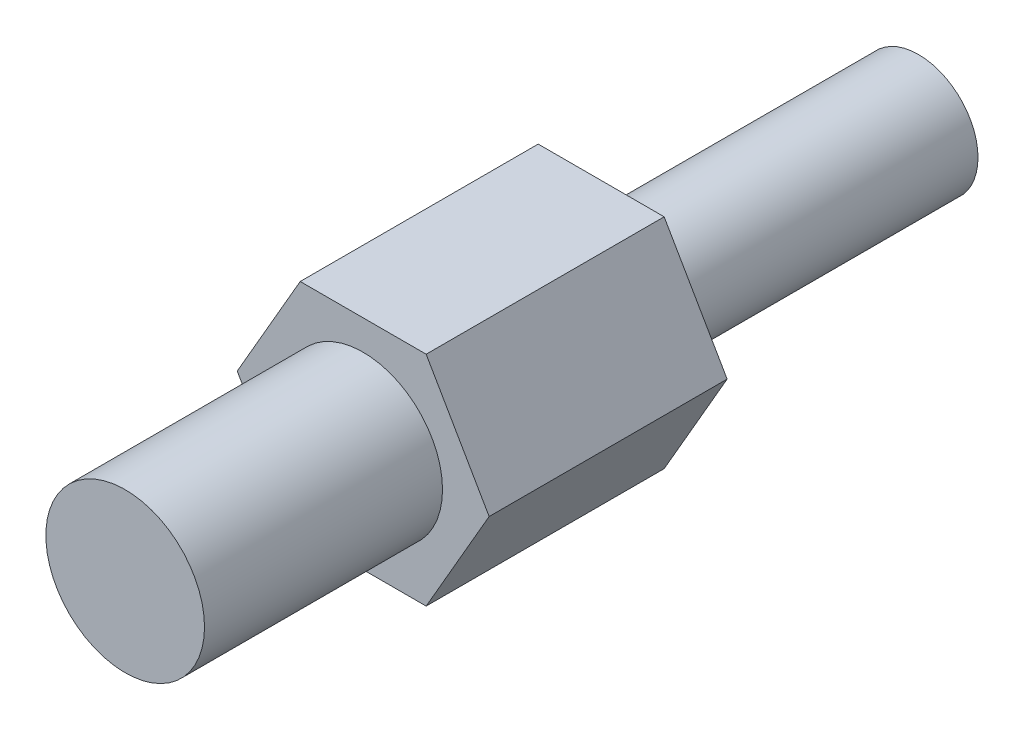
ISO-10303-21;
HEADER;
FILE_DESCRIPTION(('STEP AP214'),'2;1');
FILE_NAME('part.step','',(''),(''),'','','');
FILE_SCHEMA(('AUTOMOTIVE_DESIGN { 1 0 10303 214 1 1 1 1 }'));
ENDSEC;
DATA;
#1=APPLICATION_CONTEXT('core data for automotive mechanical design processes');
#2=APPLICATION_PROTOCOL_DEFINITION('international standard','automotive_design',2000,#1);
#3=PRODUCT_CONTEXT('',#1,'mechanical');
#4=PRODUCT('Part','Part','',(#3));
#5=PRODUCT_RELATED_PRODUCT_CATEGORY('part','',(#4));
#6=PRODUCT_DEFINITION_FORMATION('','',#4);
#7=PRODUCT_DEFINITION_CONTEXT('part definition',#1,'design');
#8=PRODUCT_DEFINITION('design','',#6,#7);
#9=PRODUCT_DEFINITION_SHAPE('','',#8);
#10=(LENGTH_UNIT() NAMED_UNIT(*) SI_UNIT(.MILLI.,.METRE.));
#11=(NAMED_UNIT(*) PLANE_ANGLE_UNIT() SI_UNIT($,.RADIAN.));
#12=(NAMED_UNIT(*) SI_UNIT($,.STERADIAN.) SOLID_ANGLE_UNIT());
#13=UNCERTAINTY_MEASURE_WITH_UNIT(LENGTH_MEASURE(1.E-05),#10,'distance_accuracy_value','');
#14=(GEOMETRIC_REPRESENTATION_CONTEXT(3) GLOBAL_UNCERTAINTY_ASSIGNED_CONTEXT((#13)) GLOBAL_UNIT_ASSIGNED_CONTEXT((#10,
#11,#12)) REPRESENTATION_CONTEXT('',''));
#15=CARTESIAN_POINT('',(0.,0.,0.));
#16=DIRECTION('',(0.,0.,1.));
#17=DIRECTION('',(1.,0.,0.));
#18=AXIS2_PLACEMENT_3D('',#15,#16,#17);
#19=CARTESIAN_POINT('',(1.58771324027147,-2.75,0.));
#20=DIRECTION('',(0.,0.,1.));
#21=DIRECTION('',(1.,0.,0.));
#22=AXIS2_PLACEMENT_3D('',#19,#20,#21);
#23=PLANE('',#22);
#24=DIRECTION('',(1.,0.,0.));
#25=VECTOR('',#24,1.);
#26=CARTESIAN_POINT('',(-1.58771324027147,-2.75,0.));
#27=LINE('',#26,#25);
#28=CARTESIAN_POINT('',(-1.58771324027147,-2.75,0.));
#29=VERTEX_POINT('',#28);
#30=CARTESIAN_POINT('',(1.58771324027147,-2.75,0.));
#31=VERTEX_POINT('',#30);
#32=EDGE_CURVE('E88',#29,#31,#27,.T.);
#33=ORIENTED_EDGE('',*,*,#32,.F.);
#34=DIRECTION('',(0.5,-0.866025403784438,0.));
#35=VECTOR('',#34,1.);
#36=CARTESIAN_POINT('',(-3.17542648054294,0.,0.));
#37=LINE('',#36,#35);
#38=CARTESIAN_POINT('',(-3.17542648054294,0.,0.));
#39=VERTEX_POINT('',#38);
#40=EDGE_CURVE('E115',#39,#29,#37,.T.);
#41=ORIENTED_EDGE('',*,*,#40,.F.);
#42=DIRECTION('',(-0.5,-0.866025403784439,0.));
#43=VECTOR('',#42,1.);
#44=CARTESIAN_POINT('',(-1.58771324027147,2.75,0.));
#45=LINE('',#44,#43);
#46=CARTESIAN_POINT('',(-1.58771324027147,2.75,0.));
#47=VERTEX_POINT('',#46);
#48=EDGE_CURVE('E113',#47,#39,#45,.T.);
#49=ORIENTED_EDGE('',*,*,#48,.F.);
#50=DIRECTION('',(-1.,0.,0.));
#51=VECTOR('',#50,1.);
#52=CARTESIAN_POINT('',(1.58771324027147,2.75,0.));
#53=LINE('',#52,#51);
#54=CARTESIAN_POINT('',(1.58771324027147,2.75,0.));
#55=VERTEX_POINT('',#54);
#56=EDGE_CURVE('E111',#55,#47,#53,.T.);
#57=ORIENTED_EDGE('',*,*,#56,.F.);
#58=DIRECTION('',(-0.5,0.866025403784438,0.));
#59=VECTOR('',#58,1.);
#60=CARTESIAN_POINT('',(3.17542648054294,0.,0.));
#61=LINE('',#60,#59);
#62=CARTESIAN_POINT('',(3.17542648054294,0.,0.));
#63=VERTEX_POINT('',#62);
#64=EDGE_CURVE('E90',#63,#55,#61,.T.);
#65=ORIENTED_EDGE('',*,*,#64,.F.);
#66=DIRECTION('',(0.5,0.866025403784439,0.));
#67=VECTOR('',#66,1.);
#68=CARTESIAN_POINT('',(1.58771324027147,-2.75,0.));
#69=LINE('',#68,#67);
#70=EDGE_CURVE('E83',#31,#63,#69,.T.);
#71=ORIENTED_EDGE('',*,*,#70,.F.);
#72=EDGE_LOOP('',(#33,#41,#49,#57,#65,#71));
#73=FACE_BOUND('',#72,.T.);
#74=CARTESIAN_POINT('',(0.,0.,0.));
#75=DIRECTION('',(0.,0.,1.));
#76=DIRECTION('',(1.,0.,0.));
#77=AXIS2_PLACEMENT_3D('',#74,#75,#76);
#78=CIRCLE('',#77,1.5);
#79=CARTESIAN_POINT('',(1.5,0.,0.));
#80=VERTEX_POINT('',#79);
#81=EDGE_CURVE('E11',#80,#80,#78,.F.);
#82=ORIENTED_EDGE('',*,*,#81,.F.);
#83=EDGE_LOOP('',(#82));
#84=FACE_BOUND('',#83,.T.);
#85=ADVANCED_FACE('F30',(#73,#84),#23,.F.);
#86=CARTESIAN_POINT('',(1.58771324027147,-2.75,6.));
#87=DIRECTION('',(0.,0.,1.));
#88=DIRECTION('',(1.,0.,0.));
#89=AXIS2_PLACEMENT_3D('',#86,#87,#88);
#90=PLANE('',#89);
#91=DIRECTION('',(1.,0.,0.));
#92=VECTOR('',#91,1.);
#93=CARTESIAN_POINT('',(-1.58771324027147,-2.75,6.));
#94=LINE('',#93,#92);
#95=CARTESIAN_POINT('',(-1.58771324027147,-2.75,6.));
#96=VERTEX_POINT('',#95);
#97=CARTESIAN_POINT('',(1.58771324027147,-2.75,6.));
#98=VERTEX_POINT('',#97);
#99=EDGE_CURVE('E117',#96,#98,#94,.T.);
#100=ORIENTED_EDGE('',*,*,#99,.T.);
#101=DIRECTION('',(0.5,0.866025403784439,0.));
#102=VECTOR('',#101,1.);
#103=CARTESIAN_POINT('',(1.58771324027147,-2.75,6.));
#104=LINE('',#103,#102);
#105=CARTESIAN_POINT('',(3.17542648054294,0.,6.));
#106=VERTEX_POINT('',#105);
#107=EDGE_CURVE('E97',#98,#106,#104,.T.);
#108=ORIENTED_EDGE('',*,*,#107,.T.);
#109=DIRECTION('',(-0.5,0.866025403784438,0.));
#110=VECTOR('',#109,1.);
#111=CARTESIAN_POINT('',(3.17542648054294,0.,6.));
#112=LINE('',#111,#110);
#113=CARTESIAN_POINT('',(1.58771324027147,2.75,6.));
#114=VERTEX_POINT('',#113);
#115=EDGE_CURVE('E120',#106,#114,#112,.T.);
#116=ORIENTED_EDGE('',*,*,#115,.T.);
#117=DIRECTION('',(-1.,0.,0.));
#118=VECTOR('',#117,1.);
#119=CARTESIAN_POINT('',(1.58771324027147,2.75,6.));
#120=LINE('',#119,#118);
#121=CARTESIAN_POINT('',(-1.58771324027147,2.75,6.));
#122=VERTEX_POINT('',#121);
#123=EDGE_CURVE('E122',#114,#122,#120,.T.);
#124=ORIENTED_EDGE('',*,*,#123,.T.);
#125=DIRECTION('',(-0.5,-0.866025403784439,0.));
#126=VECTOR('',#125,1.);
#127=CARTESIAN_POINT('',(-1.58771324027147,2.75,6.));
#128=LINE('',#127,#126);
#129=CARTESIAN_POINT('',(-3.17542648054294,0.,6.));
#130=VERTEX_POINT('',#129);
#131=EDGE_CURVE('E50',#122,#130,#128,.T.);
#132=ORIENTED_EDGE('',*,*,#131,.T.);
#133=DIRECTION('',(0.5,-0.866025403784438,0.));
#134=VECTOR('',#133,1.);
#135=CARTESIAN_POINT('',(-3.17542648054294,0.,6.));
#136=LINE('',#135,#134);
#137=EDGE_CURVE('E45',#130,#96,#136,.T.);
#138=ORIENTED_EDGE('',*,*,#137,.T.);
#139=EDGE_LOOP('',(#100,#108,#116,#124,#132,#138));
#140=FACE_BOUND('',#139,.T.);
#141=CARTESIAN_POINT('',(0.,0.,6.));
#142=DIRECTION('',(0.,0.,1.));
#143=DIRECTION('',(1.,0.,0.));
#144=AXIS2_PLACEMENT_3D('',#141,#142,#143);
#145=CIRCLE('',#144,2.);
#146=CARTESIAN_POINT('',(2.,0.,6.));
#147=VERTEX_POINT('',#146);
#148=EDGE_CURVE('E106',#147,#147,#145,.T.);
#149=ORIENTED_EDGE('',*,*,#148,.F.);
#150=EDGE_LOOP('',(#149));
#151=FACE_BOUND('',#150,.T.);
#152=ADVANCED_FACE('F141',(#140,#151),#90,.T.);
#153=CARTESIAN_POINT('',(-1.58771324027147,-2.75,6.));
#154=DIRECTION('',(0.,1.,0.));
#155=DIRECTION('',(0.,0.,1.));
#156=AXIS2_PLACEMENT_3D('',#153,#154,#155);
#157=PLANE('',#156);
#158=ORIENTED_EDGE('',*,*,#32,.T.);
#159=DIRECTION('',(0.,0.,-1.));
#160=VECTOR('',#159,1.);
#161=CARTESIAN_POINT('',(1.58771324027147,-2.75,6.));
#162=LINE('',#161,#160);
#163=EDGE_CURVE('E38',#98,#31,#162,.T.);
#164=ORIENTED_EDGE('',*,*,#163,.F.);
#165=ORIENTED_EDGE('',*,*,#99,.F.);
#166=DIRECTION('',(0.,0.,-1.));
#167=VECTOR('',#166,1.);
#168=CARTESIAN_POINT('',(-1.58771324027147,-2.75,6.));
#169=LINE('',#168,#167);
#170=EDGE_CURVE('E102',#96,#29,#169,.T.);
#171=ORIENTED_EDGE('',*,*,#170,.T.);
#172=EDGE_LOOP('',(#158,#164,#165,#171));
#173=FACE_BOUND('',#172,.T.);
#174=ADVANCED_FACE('F32',(#173),#157,.F.);
#175=CARTESIAN_POINT('',(1.58771324027147,-2.75,6.));
#176=DIRECTION('',(-0.866025403784439,0.5,0.));
#177=DIRECTION('',(-0.5,-0.866025403784439,0.));
#178=AXIS2_PLACEMENT_3D('',#175,#176,#177);
#179=PLANE('',#178);
#180=ORIENTED_EDGE('',*,*,#70,.T.);
#181=DIRECTION('',(0.,0.,-1.));
#182=VECTOR('',#181,1.);
#183=CARTESIAN_POINT('',(3.17542648054294,0.,6.));
#184=LINE('',#183,#182);
#185=EDGE_CURVE('E100',#106,#63,#184,.T.);
#186=ORIENTED_EDGE('',*,*,#185,.F.);
#187=ORIENTED_EDGE('',*,*,#107,.F.);
#188=ORIENTED_EDGE('',*,*,#163,.T.);
#189=EDGE_LOOP('',(#180,#186,#187,#188));
#190=FACE_BOUND('',#189,.T.);
#191=ADVANCED_FACE('F96',(#190),#179,.F.);
#192=CARTESIAN_POINT('',(3.17542648054294,0.,6.));
#193=DIRECTION('',(-0.866025403784438,-0.5,0.));
#194=DIRECTION('',(0.5,-0.866025403784439,0.));
#195=AXIS2_PLACEMENT_3D('',#192,#193,#194);
#196=PLANE('',#195);
#197=ORIENTED_EDGE('',*,*,#64,.T.);
#198=DIRECTION('',(0.,0.,-1.));
#199=VECTOR('',#198,1.);
#200=CARTESIAN_POINT('',(1.58771324027147,2.75,6.));
#201=LINE('',#200,#199);
#202=EDGE_CURVE('E133',#114,#55,#201,.T.);
#203=ORIENTED_EDGE('',*,*,#202,.F.);
#204=ORIENTED_EDGE('',*,*,#115,.F.);
#205=ORIENTED_EDGE('',*,*,#185,.T.);
#206=EDGE_LOOP('',(#197,#203,#204,#205));
#207=FACE_BOUND('',#206,.T.);
#208=ADVANCED_FACE('F138',(#207),#196,.F.);
#209=CARTESIAN_POINT('',(1.58771324027147,2.75,6.));
#210=DIRECTION('',(0.,-1.,0.));
#211=DIRECTION('',(0.,0.,-1.));
#212=AXIS2_PLACEMENT_3D('',#209,#210,#211);
#213=PLANE('',#212);
#214=ORIENTED_EDGE('',*,*,#56,.T.);
#215=DIRECTION('',(0.,0.,-1.));
#216=VECTOR('',#215,1.);
#217=CARTESIAN_POINT('',(-1.58771324027147,2.75,6.));
#218=LINE('',#217,#216);
#219=EDGE_CURVE('E130',#122,#47,#218,.T.);
#220=ORIENTED_EDGE('',*,*,#219,.F.);
#221=ORIENTED_EDGE('',*,*,#123,.F.);
#222=ORIENTED_EDGE('',*,*,#202,.T.);
#223=EDGE_LOOP('',(#214,#220,#221,#222));
#224=FACE_BOUND('',#223,.T.);
#225=ADVANCED_FACE('F145',(#224),#213,.F.);
#226=CARTESIAN_POINT('',(-1.58771324027147,2.75,6.));
#227=DIRECTION('',(0.866025403784439,-0.5,0.));
#228=DIRECTION('',(0.5,0.866025403784439,0.));
#229=AXIS2_PLACEMENT_3D('',#226,#227,#228);
#230=PLANE('',#229);
#231=ORIENTED_EDGE('',*,*,#48,.T.);
#232=DIRECTION('',(0.,0.,-1.));
#233=VECTOR('',#232,1.);
#234=CARTESIAN_POINT('',(-3.17542648054294,0.,6.));
#235=LINE('',#234,#233);
#236=EDGE_CURVE('E127',#130,#39,#235,.T.);
#237=ORIENTED_EDGE('',*,*,#236,.F.);
#238=ORIENTED_EDGE('',*,*,#131,.F.);
#239=ORIENTED_EDGE('',*,*,#219,.T.);
#240=EDGE_LOOP('',(#231,#237,#238,#239));
#241=FACE_BOUND('',#240,.T.);
#242=ADVANCED_FACE('F148',(#241),#230,.F.);
#243=CARTESIAN_POINT('',(-3.17542648054294,0.,6.));
#244=DIRECTION('',(0.866025403784439,0.5,0.));
#245=DIRECTION('',(-0.5,0.866025403784439,0.));
#246=AXIS2_PLACEMENT_3D('',#243,#244,#245);
#247=PLANE('',#246);
#248=ORIENTED_EDGE('',*,*,#40,.T.);
#249=ORIENTED_EDGE('',*,*,#170,.F.);
#250=ORIENTED_EDGE('',*,*,#137,.F.);
#251=ORIENTED_EDGE('',*,*,#236,.T.);
#252=EDGE_LOOP('',(#248,#249,#250,#251));
#253=FACE_BOUND('',#252,.T.);
#254=ADVANCED_FACE('F150',(#253),#247,.F.);
#255=CARTESIAN_POINT('',(0.,0.,12.));
#256=DIRECTION('',(0.,0.,-1.));
#257=DIRECTION('',(-1.,0.,0.));
#258=AXIS2_PLACEMENT_3D('',#255,#256,#257);
#259=CYLINDRICAL_SURFACE('',#258,2.);
#260=CARTESIAN_POINT('',(0.,0.,12.));
#261=DIRECTION('',(0.,0.,1.));
#262=DIRECTION('',(1.,0.,0.));
#263=AXIS2_PLACEMENT_3D('',#260,#261,#262);
#264=CIRCLE('',#263,2.);
#265=CARTESIAN_POINT('',(2.,0.,12.));
#266=VERTEX_POINT('',#265);
#267=EDGE_CURVE('E103',#266,#266,#264,.T.);
#268=ORIENTED_EDGE('',*,*,#267,.F.);
#269=EDGE_LOOP('',(#268));
#270=FACE_BOUND('',#269,.T.);
#271=ORIENTED_EDGE('',*,*,#148,.T.);
#272=EDGE_LOOP('',(#271));
#273=FACE_BOUND('',#272,.T.);
#274=ADVANCED_FACE('F152',(#270,#273),#259,.T.);
#275=CARTESIAN_POINT('',(0.,0.,12.));
#276=DIRECTION('',(0.,0.,1.));
#277=DIRECTION('',(1.,0.,0.));
#278=AXIS2_PLACEMENT_3D('',#275,#276,#277);
#279=PLANE('',#278);
#280=ORIENTED_EDGE('',*,*,#267,.T.);
#281=EDGE_LOOP('',(#280));
#282=FACE_BOUND('',#281,.T.);
#283=ADVANCED_FACE('F159',(#282),#279,.T.);
#284=CARTESIAN_POINT('',(0.,0.,-8.));
#285=DIRECTION('',(0.,0.,1.));
#286=DIRECTION('',(1.,0.,0.));
#287=AXIS2_PLACEMENT_3D('',#284,#285,#286);
#288=CYLINDRICAL_SURFACE('',#287,1.5);
#289=CARTESIAN_POINT('',(0.,0.,-8.));
#290=DIRECTION('',(0.,0.,-1.));
#291=DIRECTION('',(-1.,0.,0.));
#292=AXIS2_PLACEMENT_3D('',#289,#290,#291);
#293=CIRCLE('',#292,1.5);
#294=CARTESIAN_POINT('',(-1.5,0.,-8.));
#295=VERTEX_POINT('',#294);
#296=EDGE_CURVE('E183',#295,#295,#293,.T.);
#297=ORIENTED_EDGE('',*,*,#296,.F.);
#298=EDGE_LOOP('',(#297));
#299=FACE_BOUND('',#298,.T.);
#300=ORIENTED_EDGE('',*,*,#81,.T.);
#301=EDGE_LOOP('',(#300));
#302=FACE_BOUND('',#301,.T.);
#303=ADVANCED_FACE('F172',(#299,#302),#288,.T.);
#304=CARTESIAN_POINT('',(0.,0.,-8.));
#305=DIRECTION('',(0.,0.,-1.));
#306=DIRECTION('',(-1.,0.,0.));
#307=AXIS2_PLACEMENT_3D('',#304,#305,#306);
#308=PLANE('',#307);
#309=ORIENTED_EDGE('',*,*,#296,.T.);
#310=EDGE_LOOP('',(#309));
#311=FACE_BOUND('',#310,.T.);
#312=ADVANCED_FACE('F175',(#311),#308,.T.);
#313=CLOSED_SHELL('',(#85,#152,#174,#191,#208,#225,#242,#254,#274,#283,#303,#312));
#314=MANIFOLD_SOLID_BREP('B2',#313);
#315=ADVANCED_BREP_SHAPE_REPRESENTATION('',(#18,#314),#14);
#316=SHAPE_DEFINITION_REPRESENTATION(#9,#315);
ENDSEC;
END-ISO-10303-21;
